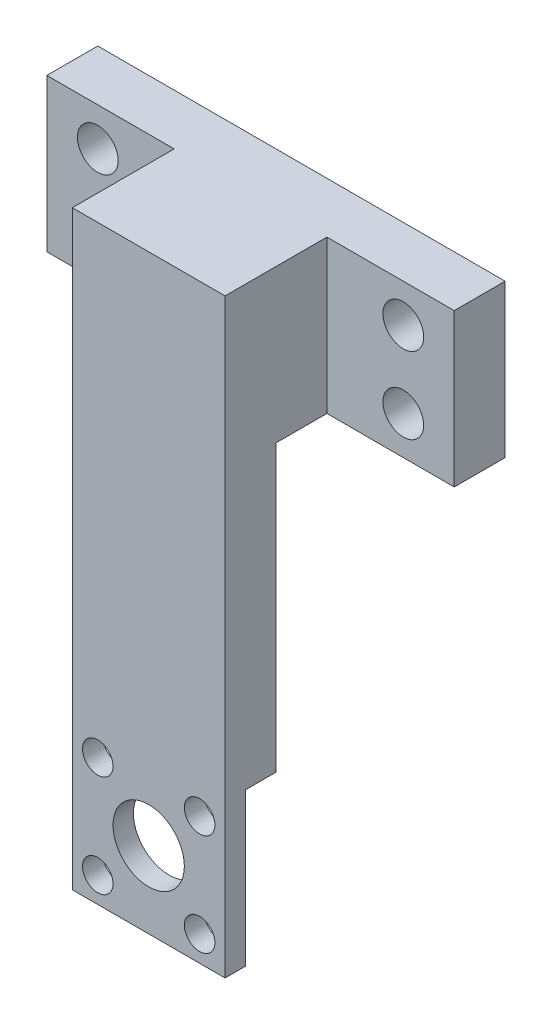
ISO-10303-21;
HEADER;
FILE_DESCRIPTION(('STEP AP214'),'2;1');
FILE_NAME('part.step','',(''),(''),'','','');
FILE_SCHEMA(('AUTOMOTIVE_DESIGN { 1 0 10303 214 1 1 1 1 }'));
ENDSEC;
DATA;
#1=APPLICATION_CONTEXT('core data for automotive mechanical design processes');
#2=APPLICATION_PROTOCOL_DEFINITION('international standard','automotive_design',2000,#1);
#3=PRODUCT_CONTEXT('',#1,'mechanical');
#4=PRODUCT('Part','Part','',(#3));
#5=PRODUCT_RELATED_PRODUCT_CATEGORY('part','',(#4));
#6=PRODUCT_DEFINITION_FORMATION('','',#4);
#7=PRODUCT_DEFINITION_CONTEXT('part definition',#1,'design');
#8=PRODUCT_DEFINITION('design','',#6,#7);
#9=PRODUCT_DEFINITION_SHAPE('','',#8);
#10=(LENGTH_UNIT() NAMED_UNIT(*) SI_UNIT(.MILLI.,.METRE.));
#11=(NAMED_UNIT(*) PLANE_ANGLE_UNIT() SI_UNIT($,.RADIAN.));
#12=(NAMED_UNIT(*) SI_UNIT($,.STERADIAN.) SOLID_ANGLE_UNIT());
#13=UNCERTAINTY_MEASURE_WITH_UNIT(LENGTH_MEASURE(1.E-05),#10,'distance_accuracy_value','');
#14=(GEOMETRIC_REPRESENTATION_CONTEXT(3) GLOBAL_UNCERTAINTY_ASSIGNED_CONTEXT((#13)) GLOBAL_UNIT_ASSIGNED_CONTEXT((#10,
#11,#12)) REPRESENTATION_CONTEXT('',''));
#15=CARTESIAN_POINT('',(0.,0.,0.));
#16=DIRECTION('',(0.,0.,1.));
#17=DIRECTION('',(1.,0.,0.));
#18=AXIS2_PLACEMENT_3D('',#15,#16,#17);
#19=CARTESIAN_POINT('',(0.,0.,5.));
#20=DIRECTION('',(0.,1.,0.));
#21=DIRECTION('',(0.,0.,1.));
#22=AXIS2_PLACEMENT_3D('',#19,#20,#21);
#23=PLANE('',#22);
#24=DIRECTION('',(1.,0.,0.));
#25=VECTOR('',#24,1.);
#26=CARTESIAN_POINT('',(12.5,0.,10.));
#27=LINE('',#26,#25);
#28=CARTESIAN_POINT('',(12.5,0.,10.));
#29=VERTEX_POINT('',#28);
#30=CARTESIAN_POINT('',(27.5,0.,10.));
#31=VERTEX_POINT('',#30);
#32=EDGE_CURVE('E62',#29,#31,#27,.T.);
#33=ORIENTED_EDGE('',*,*,#32,.F.);
#34=DIRECTION('',(0.,0.,-1.));
#35=VECTOR('',#34,1.);
#36=CARTESIAN_POINT('',(12.5,0.,15.));
#37=LINE('',#36,#35);
#38=CARTESIAN_POINT('',(12.5,0.,5.));
#39=VERTEX_POINT('',#38);
#40=EDGE_CURVE('E188',#29,#39,#37,.T.);
#41=ORIENTED_EDGE('',*,*,#40,.T.);
#42=DIRECTION('',(1.,0.,0.));
#43=VECTOR('',#42,1.);
#44=CARTESIAN_POINT('',(0.,0.,5.));
#45=LINE('',#44,#43);
#46=CARTESIAN_POINT('',(0.,0.,5.));
#47=VERTEX_POINT('',#46);
#48=EDGE_CURVE('E220',#47,#39,#45,.T.);
#49=ORIENTED_EDGE('',*,*,#48,.F.);
#50=DIRECTION('',(0.,0.,-1.));
#51=VECTOR('',#50,1.);
#52=CARTESIAN_POINT('',(0.,0.,5.));
#53=LINE('',#52,#51);
#54=CARTESIAN_POINT('',(0.,0.,0.));
#55=VERTEX_POINT('',#54);
#56=EDGE_CURVE('E11',#47,#55,#53,.T.);
#57=ORIENTED_EDGE('',*,*,#56,.T.);
#58=DIRECTION('',(1.,0.,0.));
#59=VECTOR('',#58,1.);
#60=CARTESIAN_POINT('',(0.,0.,0.));
#61=LINE('',#60,#59);
#62=CARTESIAN_POINT('',(40.,0.,0.));
#63=VERTEX_POINT('',#62);
#64=EDGE_CURVE('E231',#55,#63,#61,.T.);
#65=ORIENTED_EDGE('',*,*,#64,.T.);
#66=DIRECTION('',(0.,0.,-1.));
#67=VECTOR('',#66,1.);
#68=CARTESIAN_POINT('',(40.,0.,5.));
#69=LINE('',#68,#67);
#70=CARTESIAN_POINT('',(40.,0.,5.));
#71=VERTEX_POINT('',#70);
#72=EDGE_CURVE('E47',#71,#63,#69,.T.);
#73=ORIENTED_EDGE('',*,*,#72,.F.);
#74=CARTESIAN_POINT('',(27.5,0.,5.));
#75=VERTEX_POINT('',#74);
#76=EDGE_CURVE('E218',#75,#71,#45,.T.);
#77=ORIENTED_EDGE('',*,*,#76,.F.);
#78=DIRECTION('',(0.,0.,-1.));
#79=VECTOR('',#78,1.);
#80=CARTESIAN_POINT('',(27.5,0.,15.));
#81=LINE('',#80,#79);
#82=EDGE_CURVE('E186',#31,#75,#81,.T.);
#83=ORIENTED_EDGE('',*,*,#82,.F.);
#84=EDGE_LOOP('',(#33,#41,#49,#57,#65,#73,#77,#83));
#85=FACE_BOUND('',#84,.T.);
#86=ADVANCED_FACE('F39',(#85),#23,.F.);
#87=CARTESIAN_POINT('',(0.,0.,5.));
#88=DIRECTION('',(0.,0.,-1.));
#89=DIRECTION('',(-1.,0.,0.));
#90=AXIS2_PLACEMENT_3D('',#87,#88,#89);
#91=PLANE('',#90);
#92=CARTESIAN_POINT('',(5.,11.25,5.));
#93=DIRECTION('',(0.,0.,1.));
#94=DIRECTION('',(-1.,0.,0.));
#95=AXIS2_PLACEMENT_3D('',#92,#93,#94);
#96=CIRCLE('',#95,2.);
#97=CARTESIAN_POINT('',(3.,11.25,5.));
#98=VERTEX_POINT('',#97);
#99=EDGE_CURVE('E203',#98,#98,#96,.T.);
#100=ORIENTED_EDGE('',*,*,#99,.F.);
#101=EDGE_LOOP('',(#100));
#102=FACE_BOUND('',#101,.T.);
#103=CARTESIAN_POINT('',(5.,3.75,5.));
#104=DIRECTION('',(0.,0.,1.));
#105=DIRECTION('',(1.,0.,0.));
#106=AXIS2_PLACEMENT_3D('',#103,#104,#105);
#107=CIRCLE('',#106,2.);
#108=CARTESIAN_POINT('',(7.,3.75,5.));
#109=VERTEX_POINT('',#108);
#110=EDGE_CURVE('E209',#109,#109,#107,.T.);
#111=ORIENTED_EDGE('',*,*,#110,.F.);
#112=EDGE_LOOP('',(#111));
#113=FACE_BOUND('',#112,.T.);
#114=DIRECTION('',(0.,-1.,0.));
#115=VECTOR('',#114,1.);
#116=CARTESIAN_POINT('',(12.5,15.,5.));
#117=LINE('',#116,#115);
#118=CARTESIAN_POINT('',(12.5,15.,5.));
#119=VERTEX_POINT('',#118);
#120=EDGE_CURVE('E169',#119,#39,#117,.T.);
#121=ORIENTED_EDGE('',*,*,#120,.F.);
#122=DIRECTION('',(-1.,0.,0.));
#123=VECTOR('',#122,1.);
#124=CARTESIAN_POINT('',(0.,15.,5.));
#125=LINE('',#124,#123);
#126=CARTESIAN_POINT('',(0.,15.,5.));
#127=VERTEX_POINT('',#126);
#128=EDGE_CURVE('E225',#119,#127,#125,.T.);
#129=ORIENTED_EDGE('',*,*,#128,.T.);
#130=DIRECTION('',(0.,-1.,0.));
#131=VECTOR('',#130,1.);
#132=CARTESIAN_POINT('',(0.,0.,5.));
#133=LINE('',#132,#131);
#134=EDGE_CURVE('E215',#127,#47,#133,.T.);
#135=ORIENTED_EDGE('',*,*,#134,.T.);
#136=ORIENTED_EDGE('',*,*,#48,.T.);
#137=EDGE_LOOP('',(#121,#129,#135,#136));
#138=FACE_BOUND('',#137,.T.);
#139=ADVANCED_FACE('F262',(#102,#113,#138),#91,.F.);
#140=CARTESIAN_POINT('',(35.,11.25,5.));
#141=DIRECTION('',(0.,0.,1.));
#142=DIRECTION('',(1.,0.,0.));
#143=AXIS2_PLACEMENT_3D('',#140,#141,#142);
#144=CIRCLE('',#143,2.);
#145=CARTESIAN_POINT('',(37.,11.25,5.));
#146=VERTEX_POINT('',#145);
#147=EDGE_CURVE('E191',#146,#146,#144,.T.);
#148=ORIENTED_EDGE('',*,*,#147,.F.);
#149=EDGE_LOOP('',(#148));
#150=FACE_BOUND('',#149,.T.);
#151=CARTESIAN_POINT('',(35.,3.75,5.));
#152=DIRECTION('',(0.,0.,1.));
#153=DIRECTION('',(-1.,0.,0.));
#154=AXIS2_PLACEMENT_3D('',#151,#152,#153);
#155=CIRCLE('',#154,2.);
#156=CARTESIAN_POINT('',(33.,3.75,5.));
#157=VERTEX_POINT('',#156);
#158=EDGE_CURVE('E197',#157,#157,#155,.T.);
#159=ORIENTED_EDGE('',*,*,#158,.F.);
#160=EDGE_LOOP('',(#159));
#161=FACE_BOUND('',#160,.T.);
#162=DIRECTION('',(0.,1.,0.));
#163=VECTOR('',#162,1.);
#164=CARTESIAN_POINT('',(27.5,15.,5.));
#165=LINE('',#164,#163);
#166=CARTESIAN_POINT('',(27.5,15.,5.));
#167=VERTEX_POINT('',#166);
#168=EDGE_CURVE('E173',#75,#167,#165,.T.);
#169=ORIENTED_EDGE('',*,*,#168,.F.);
#170=ORIENTED_EDGE('',*,*,#76,.T.);
#171=DIRECTION('',(0.,1.,0.));
#172=VECTOR('',#171,1.);
#173=CARTESIAN_POINT('',(40.,0.,5.));
#174=LINE('',#173,#172);
#175=CARTESIAN_POINT('',(40.,15.,5.));
#176=VERTEX_POINT('',#175);
#177=EDGE_CURVE('E223',#71,#176,#174,.T.);
#178=ORIENTED_EDGE('',*,*,#177,.T.);
#179=EDGE_CURVE('E226',#176,#167,#125,.T.);
#180=ORIENTED_EDGE('',*,*,#179,.T.);
#181=EDGE_LOOP('',(#169,#170,#178,#180));
#182=FACE_BOUND('',#181,.T.);
#183=ADVANCED_FACE('F272',(#150,#161,#182),#91,.F.);
#184=CARTESIAN_POINT('',(0.,0.,0.));
#185=DIRECTION('',(0.,0.,-1.));
#186=DIRECTION('',(-1.,0.,0.));
#187=AXIS2_PLACEMENT_3D('',#184,#185,#186);
#188=PLANE('',#187);
#189=CARTESIAN_POINT('',(35.,3.75,0.));
#190=DIRECTION('',(0.,0.,1.));
#191=DIRECTION('',(-1.,0.,0.));
#192=AXIS2_PLACEMENT_3D('',#189,#190,#191);
#193=CIRCLE('',#192,2.);
#194=CARTESIAN_POINT('',(33.,3.75,0.));
#195=VERTEX_POINT('',#194);
#196=EDGE_CURVE('E194',#195,#195,#193,.T.);
#197=ORIENTED_EDGE('',*,*,#196,.T.);
#198=EDGE_LOOP('',(#197));
#199=FACE_BOUND('',#198,.T.);
#200=CARTESIAN_POINT('',(5.,3.75,0.));
#201=DIRECTION('',(0.,0.,1.));
#202=DIRECTION('',(1.,0.,0.));
#203=AXIS2_PLACEMENT_3D('',#200,#201,#202);
#204=CIRCLE('',#203,2.);
#205=CARTESIAN_POINT('',(7.,3.75,0.));
#206=VERTEX_POINT('',#205);
#207=EDGE_CURVE('E206',#206,#206,#204,.T.);
#208=ORIENTED_EDGE('',*,*,#207,.T.);
#209=EDGE_LOOP('',(#208));
#210=FACE_BOUND('',#209,.T.);
#211=DIRECTION('',(0.,-1.,0.));
#212=VECTOR('',#211,1.);
#213=CARTESIAN_POINT('',(0.,0.,0.));
#214=LINE('',#213,#212);
#215=CARTESIAN_POINT('',(0.,15.,0.));
#216=VERTEX_POINT('',#215);
#217=EDGE_CURVE('E212',#216,#55,#214,.T.);
#218=ORIENTED_EDGE('',*,*,#217,.F.);
#219=DIRECTION('',(-1.,0.,0.));
#220=VECTOR('',#219,1.);
#221=CARTESIAN_POINT('',(0.,15.,0.));
#222=LINE('',#221,#220);
#223=CARTESIAN_POINT('',(40.,15.,0.));
#224=VERTEX_POINT('',#223);
#225=EDGE_CURVE('E219',#224,#216,#222,.T.);
#226=ORIENTED_EDGE('',*,*,#225,.F.);
#227=DIRECTION('',(0.,1.,0.));
#228=VECTOR('',#227,1.);
#229=CARTESIAN_POINT('',(40.,0.,0.));
#230=LINE('',#229,#228);
#231=EDGE_CURVE('E233',#63,#224,#230,.T.);
#232=ORIENTED_EDGE('',*,*,#231,.F.);
#233=ORIENTED_EDGE('',*,*,#64,.F.);
#234=EDGE_LOOP('',(#218,#226,#232,#233));
#235=FACE_BOUND('',#234,.T.);
#236=CARTESIAN_POINT('',(5.,11.25,0.));
#237=DIRECTION('',(0.,0.,1.));
#238=DIRECTION('',(-1.,0.,0.));
#239=AXIS2_PLACEMENT_3D('',#236,#237,#238);
#240=CIRCLE('',#239,2.);
#241=CARTESIAN_POINT('',(3.,11.25,0.));
#242=VERTEX_POINT('',#241);
#243=EDGE_CURVE('E200',#242,#242,#240,.T.);
#244=ORIENTED_EDGE('',*,*,#243,.T.);
#245=EDGE_LOOP('',(#244));
#246=FACE_BOUND('',#245,.T.);
#247=CARTESIAN_POINT('',(35.,11.25,0.));
#248=DIRECTION('',(0.,0.,1.));
#249=DIRECTION('',(1.,0.,0.));
#250=AXIS2_PLACEMENT_3D('',#247,#248,#249);
#251=CIRCLE('',#250,2.);
#252=CARTESIAN_POINT('',(37.,11.25,0.));
#253=VERTEX_POINT('',#252);
#254=EDGE_CURVE('E190',#253,#253,#251,.T.);
#255=ORIENTED_EDGE('',*,*,#254,.T.);
#256=EDGE_LOOP('',(#255));
#257=FACE_BOUND('',#256,.T.);
#258=ADVANCED_FACE('F251',(#199,#210,#235,#246,#257),#188,.T.);
#259=CARTESIAN_POINT('',(0.,0.,5.));
#260=DIRECTION('',(1.,0.,0.));
#261=DIRECTION('',(0.,0.,-1.));
#262=AXIS2_PLACEMENT_3D('',#259,#260,#261);
#263=PLANE('',#262);
#264=ORIENTED_EDGE('',*,*,#217,.T.);
#265=ORIENTED_EDGE('',*,*,#56,.F.);
#266=ORIENTED_EDGE('',*,*,#134,.F.);
#267=DIRECTION('',(0.,0.,-1.));
#268=VECTOR('',#267,1.);
#269=CARTESIAN_POINT('',(0.,15.,5.));
#270=LINE('',#269,#268);
#271=EDGE_CURVE('E228',#127,#216,#270,.T.);
#272=ORIENTED_EDGE('',*,*,#271,.T.);
#273=EDGE_LOOP('',(#264,#265,#266,#272));
#274=FACE_BOUND('',#273,.T.);
#275=ADVANCED_FACE('F41',(#274),#263,.F.);
#276=CARTESIAN_POINT('',(40.,0.,5.));
#277=DIRECTION('',(-1.,0.,0.));
#278=DIRECTION('',(0.,0.,1.));
#279=AXIS2_PLACEMENT_3D('',#276,#277,#278);
#280=PLANE('',#279);
#281=ORIENTED_EDGE('',*,*,#231,.T.);
#282=DIRECTION('',(0.,0.,-1.));
#283=VECTOR('',#282,1.);
#284=CARTESIAN_POINT('',(40.,15.,5.));
#285=LINE('',#284,#283);
#286=EDGE_CURVE('E238',#176,#224,#285,.T.);
#287=ORIENTED_EDGE('',*,*,#286,.F.);
#288=ORIENTED_EDGE('',*,*,#177,.F.);
#289=ORIENTED_EDGE('',*,*,#72,.T.);
#290=EDGE_LOOP('',(#281,#287,#288,#289));
#291=FACE_BOUND('',#290,.T.);
#292=ADVANCED_FACE('F245',(#291),#280,.F.);
#293=CARTESIAN_POINT('',(0.,15.,5.));
#294=DIRECTION('',(0.,-1.,0.));
#295=DIRECTION('',(0.,0.,-1.));
#296=AXIS2_PLACEMENT_3D('',#293,#294,#295);
#297=PLANE('',#296);
#298=ORIENTED_EDGE('',*,*,#225,.T.);
#299=ORIENTED_EDGE('',*,*,#271,.F.);
#300=ORIENTED_EDGE('',*,*,#128,.F.);
#301=DIRECTION('',(0.,0.,-1.));
#302=VECTOR('',#301,1.);
#303=CARTESIAN_POINT('',(12.5,15.,15.));
#304=LINE('',#303,#302);
#305=CARTESIAN_POINT('',(12.5,15.,15.));
#306=VERTEX_POINT('',#305);
#307=EDGE_CURVE('E177',#306,#119,#304,.T.);
#308=ORIENTED_EDGE('',*,*,#307,.F.);
#309=DIRECTION('',(-1.,0.,0.));
#310=VECTOR('',#309,1.);
#311=CARTESIAN_POINT('',(12.5,15.,15.));
#312=LINE('',#311,#310);
#313=CARTESIAN_POINT('',(27.5,15.,15.));
#314=VERTEX_POINT('',#313);
#315=EDGE_CURVE('E175',#314,#306,#312,.T.);
#316=ORIENTED_EDGE('',*,*,#315,.F.);
#317=DIRECTION('',(0.,0.,-1.));
#318=VECTOR('',#317,1.);
#319=CARTESIAN_POINT('',(27.5,15.,15.));
#320=LINE('',#319,#318);
#321=EDGE_CURVE('E183',#314,#167,#320,.T.);
#322=ORIENTED_EDGE('',*,*,#321,.T.);
#323=ORIENTED_EDGE('',*,*,#179,.F.);
#324=ORIENTED_EDGE('',*,*,#286,.T.);
#325=EDGE_LOOP('',(#298,#299,#300,#308,#316,#322,#323,#324));
#326=FACE_BOUND('',#325,.T.);
#327=ADVANCED_FACE('F255',(#326),#297,.F.);
#328=CARTESIAN_POINT('',(5.,3.75,5.));
#329=DIRECTION('',(0.,0.,-1.));
#330=DIRECTION('',(-1.,0.,0.));
#331=AXIS2_PLACEMENT_3D('',#328,#329,#330);
#332=CYLINDRICAL_SURFACE('',#331,2.);
#333=ORIENTED_EDGE('',*,*,#110,.T.);
#334=EDGE_LOOP('',(#333));
#335=FACE_BOUND('',#334,.T.);
#336=ORIENTED_EDGE('',*,*,#207,.F.);
#337=EDGE_LOOP('',(#336));
#338=FACE_BOUND('',#337,.T.);
#339=ADVANCED_FACE('F348',(#335,#338),#332,.F.);
#340=CARTESIAN_POINT('',(5.,11.25,5.));
#341=DIRECTION('',(0.,0.,-1.));
#342=DIRECTION('',(-1.,0.,0.));
#343=AXIS2_PLACEMENT_3D('',#340,#341,#342);
#344=CYLINDRICAL_SURFACE('',#343,2.);
#345=ORIENTED_EDGE('',*,*,#99,.T.);
#346=EDGE_LOOP('',(#345));
#347=FACE_BOUND('',#346,.T.);
#348=ORIENTED_EDGE('',*,*,#243,.F.);
#349=EDGE_LOOP('',(#348));
#350=FACE_BOUND('',#349,.T.);
#351=ADVANCED_FACE('F354',(#347,#350),#344,.F.);
#352=CARTESIAN_POINT('',(35.,3.75,5.));
#353=DIRECTION('',(0.,0.,-1.));
#354=DIRECTION('',(-1.,0.,0.));
#355=AXIS2_PLACEMENT_3D('',#352,#353,#354);
#356=CYLINDRICAL_SURFACE('',#355,2.);
#357=ORIENTED_EDGE('',*,*,#158,.T.);
#358=EDGE_LOOP('',(#357));
#359=FACE_BOUND('',#358,.T.);
#360=ORIENTED_EDGE('',*,*,#196,.F.);
#361=EDGE_LOOP('',(#360));
#362=FACE_BOUND('',#361,.T.);
#363=ADVANCED_FACE('F358',(#359,#362),#356,.F.);
#364=CARTESIAN_POINT('',(35.,11.25,5.));
#365=DIRECTION('',(0.,0.,-1.));
#366=DIRECTION('',(-1.,0.,0.));
#367=AXIS2_PLACEMENT_3D('',#364,#365,#366);
#368=CYLINDRICAL_SURFACE('',#367,2.);
#369=ORIENTED_EDGE('',*,*,#147,.T.);
#370=EDGE_LOOP('',(#369));
#371=FACE_BOUND('',#370,.T.);
#372=ORIENTED_EDGE('',*,*,#254,.F.);
#373=EDGE_LOOP('',(#372));
#374=FACE_BOUND('',#373,.T.);
#375=ADVANCED_FACE('F362',(#371,#374),#368,.F.);
#376=CARTESIAN_POINT('',(12.5,15.,15.));
#377=DIRECTION('',(1.,0.,0.));
#378=DIRECTION('',(0.,1.,0.));
#379=AXIS2_PLACEMENT_3D('',#376,#377,#378);
#380=PLANE('',#379);
#381=ORIENTED_EDGE('',*,*,#120,.T.);
#382=ORIENTED_EDGE('',*,*,#40,.F.);
#383=DIRECTION('',(0.,1.,0.));
#384=VECTOR('',#383,1.);
#385=CARTESIAN_POINT('',(12.5,-28.,10.));
#386=LINE('',#385,#384);
#387=CARTESIAN_POINT('',(12.5,-28.,10.));
#388=VERTEX_POINT('',#387);
#389=EDGE_CURVE('E166',#388,#29,#386,.T.);
#390=ORIENTED_EDGE('',*,*,#389,.F.);
#391=DIRECTION('',(0.,0.,-1.));
#392=VECTOR('',#391,1.);
#393=CARTESIAN_POINT('',(12.5,-28.,15.));
#394=LINE('',#393,#392);
#395=CARTESIAN_POINT('',(12.5,-28.,13.));
#396=VERTEX_POINT('',#395);
#397=EDGE_CURVE('E152',#396,#388,#394,.T.);
#398=ORIENTED_EDGE('',*,*,#397,.F.);
#399=DIRECTION('',(0.,1.,0.));
#400=VECTOR('',#399,1.);
#401=CARTESIAN_POINT('',(12.5,-43.,13.));
#402=LINE('',#401,#400);
#403=CARTESIAN_POINT('',(12.5,-43.,13.));
#404=VERTEX_POINT('',#403);
#405=EDGE_CURVE('E132',#404,#396,#402,.T.);
#406=ORIENTED_EDGE('',*,*,#405,.F.);
#407=DIRECTION('',(0.,0.,-1.));
#408=VECTOR('',#407,1.);
#409=CARTESIAN_POINT('',(12.5,-43.,15.));
#410=LINE('',#409,#408);
#411=CARTESIAN_POINT('',(12.5,-43.,15.));
#412=VERTEX_POINT('',#411);
#413=EDGE_CURVE('E139',#412,#404,#410,.T.);
#414=ORIENTED_EDGE('',*,*,#413,.F.);
#415=DIRECTION('',(0.,-1.,0.));
#416=VECTOR('',#415,1.);
#417=CARTESIAN_POINT('',(12.5,15.,15.));
#418=LINE('',#417,#416);
#419=EDGE_CURVE('E170',#306,#412,#418,.T.);
#420=ORIENTED_EDGE('',*,*,#419,.F.);
#421=ORIENTED_EDGE('',*,*,#307,.T.);
#422=EDGE_LOOP('',(#381,#382,#390,#398,#406,#414,#420,#421));
#423=FACE_BOUND('',#422,.T.);
#424=ADVANCED_FACE('F150',(#423),#380,.F.);
#425=CARTESIAN_POINT('',(27.5,15.,15.));
#426=DIRECTION('',(-1.,0.,0.));
#427=DIRECTION('',(0.,0.,1.));
#428=AXIS2_PLACEMENT_3D('',#425,#426,#427);
#429=PLANE('',#428);
#430=ORIENTED_EDGE('',*,*,#168,.T.);
#431=ORIENTED_EDGE('',*,*,#321,.F.);
#432=DIRECTION('',(0.,1.,0.));
#433=VECTOR('',#432,1.);
#434=CARTESIAN_POINT('',(27.5,15.,15.));
#435=LINE('',#434,#433);
#436=CARTESIAN_POINT('',(27.5,-43.,15.));
#437=VERTEX_POINT('',#436);
#438=EDGE_CURVE('E172',#437,#314,#435,.T.);
#439=ORIENTED_EDGE('',*,*,#438,.F.);
#440=DIRECTION('',(0.,0.,1.));
#441=VECTOR('',#440,1.);
#442=CARTESIAN_POINT('',(27.5,-43.,15.));
#443=LINE('',#442,#441);
#444=CARTESIAN_POINT('',(27.5,-43.,13.));
#445=VERTEX_POINT('',#444);
#446=EDGE_CURVE('E138',#445,#437,#443,.T.);
#447=ORIENTED_EDGE('',*,*,#446,.F.);
#448=DIRECTION('',(0.,1.,0.));
#449=VECTOR('',#448,1.);
#450=CARTESIAN_POINT('',(27.5,-43.,13.));
#451=LINE('',#450,#449);
#452=CARTESIAN_POINT('',(27.5,-28.,13.));
#453=VERTEX_POINT('',#452);
#454=EDGE_CURVE('E134',#445,#453,#451,.T.);
#455=ORIENTED_EDGE('',*,*,#454,.T.);
#456=DIRECTION('',(0.,0.,1.));
#457=VECTOR('',#456,1.);
#458=CARTESIAN_POINT('',(27.5,-28.,15.));
#459=LINE('',#458,#457);
#460=CARTESIAN_POINT('',(27.5,-28.,10.));
#461=VERTEX_POINT('',#460);
#462=EDGE_CURVE('E161',#461,#453,#459,.T.);
#463=ORIENTED_EDGE('',*,*,#462,.F.);
#464=DIRECTION('',(0.,1.,0.));
#465=VECTOR('',#464,1.);
#466=CARTESIAN_POINT('',(27.5,-28.,10.));
#467=LINE('',#466,#465);
#468=EDGE_CURVE('E162',#461,#31,#467,.T.);
#469=ORIENTED_EDGE('',*,*,#468,.T.);
#470=ORIENTED_EDGE('',*,*,#82,.T.);
#471=EDGE_LOOP('',(#430,#431,#439,#447,#455,#463,#469,#470));
#472=FACE_BOUND('',#471,.T.);
#473=ADVANCED_FACE('F269',(#472),#429,.F.);
#474=CARTESIAN_POINT('',(0.,0.,15.));
#475=DIRECTION('',(0.,0.,1.));
#476=DIRECTION('',(1.,0.,0.));
#477=AXIS2_PLACEMENT_3D('',#474,#475,#476);
#478=PLANE('',#477);
#479=CARTESIAN_POINT('',(20.,-35.5,15.));
#480=DIRECTION('',(0.,0.,1.));
#481=DIRECTION('',(1.,0.,0.));
#482=AXIS2_PLACEMENT_3D('',#479,#480,#481);
#483=CIRCLE('',#482,3.5);
#484=CARTESIAN_POINT('',(23.5,-35.5,15.));
#485=VERTEX_POINT('',#484);
#486=EDGE_CURVE('E279',#485,#485,#483,.T.);
#487=ORIENTED_EDGE('',*,*,#486,.F.);
#488=EDGE_LOOP('',(#487));
#489=FACE_BOUND('',#488,.T.);
#490=CARTESIAN_POINT('',(25.,-30.5,15.));
#491=DIRECTION('',(0.,0.,1.));
#492=DIRECTION('',(1.,0.,0.));
#493=AXIS2_PLACEMENT_3D('',#490,#491,#492);
#494=CIRCLE('',#493,1.5);
#495=CARTESIAN_POINT('',(26.5,-30.5,15.));
#496=VERTEX_POINT('',#495);
#497=EDGE_CURVE('E281',#496,#496,#494,.T.);
#498=ORIENTED_EDGE('',*,*,#497,.F.);
#499=EDGE_LOOP('',(#498));
#500=FACE_BOUND('',#499,.T.);
#501=CARTESIAN_POINT('',(15.,-40.5,15.));
#502=DIRECTION('',(0.,0.,1.));
#503=DIRECTION('',(1.,0.,0.));
#504=AXIS2_PLACEMENT_3D('',#501,#502,#503);
#505=CIRCLE('',#504,1.5);
#506=CARTESIAN_POINT('',(16.5,-40.5,15.));
#507=VERTEX_POINT('',#506);
#508=EDGE_CURVE('E288',#507,#507,#505,.T.);
#509=ORIENTED_EDGE('',*,*,#508,.F.);
#510=EDGE_LOOP('',(#509));
#511=FACE_BOUND('',#510,.T.);
#512=CARTESIAN_POINT('',(25.,-40.5,15.));
#513=DIRECTION('',(0.,0.,1.));
#514=DIRECTION('',(1.,0.,0.));
#515=AXIS2_PLACEMENT_3D('',#512,#513,#514);
#516=CIRCLE('',#515,1.5);
#517=CARTESIAN_POINT('',(26.5,-40.5,15.));
#518=VERTEX_POINT('',#517);
#519=EDGE_CURVE('E291',#518,#518,#516,.T.);
#520=ORIENTED_EDGE('',*,*,#519,.F.);
#521=EDGE_LOOP('',(#520));
#522=FACE_BOUND('',#521,.T.);
#523=CARTESIAN_POINT('',(15.,-30.5,15.));
#524=DIRECTION('',(0.,0.,1.));
#525=DIRECTION('',(1.,0.,0.));
#526=AXIS2_PLACEMENT_3D('',#523,#524,#525);
#527=CIRCLE('',#526,1.5);
#528=CARTESIAN_POINT('',(16.5,-30.5,15.));
#529=VERTEX_POINT('',#528);
#530=EDGE_CURVE('E294',#529,#529,#527,.T.);
#531=ORIENTED_EDGE('',*,*,#530,.F.);
#532=EDGE_LOOP('',(#531));
#533=FACE_BOUND('',#532,.T.);
#534=ORIENTED_EDGE('',*,*,#419,.T.);
#535=DIRECTION('',(-1.,0.,0.));
#536=VECTOR('',#535,1.);
#537=CARTESIAN_POINT('',(12.5,-43.,15.));
#538=LINE('',#537,#536);
#539=EDGE_CURVE('E145',#437,#412,#538,.T.);
#540=ORIENTED_EDGE('',*,*,#539,.F.);
#541=ORIENTED_EDGE('',*,*,#438,.T.);
#542=ORIENTED_EDGE('',*,*,#315,.T.);
#543=EDGE_LOOP('',(#534,#540,#541,#542));
#544=FACE_BOUND('',#543,.T.);
#545=ADVANCED_FACE('F266',(#489,#500,#511,#522,#533,#544),#478,.T.);
#546=CARTESIAN_POINT('',(12.5,-28.,10.));
#547=DIRECTION('',(0.,0.,1.));
#548=DIRECTION('',(1.,0.,0.));
#549=AXIS2_PLACEMENT_3D('',#546,#547,#548);
#550=PLANE('',#549);
#551=ORIENTED_EDGE('',*,*,#32,.T.);
#552=ORIENTED_EDGE('',*,*,#468,.F.);
#553=DIRECTION('',(1.,0.,0.));
#554=VECTOR('',#553,1.);
#555=CARTESIAN_POINT('',(12.5,-28.,10.));
#556=LINE('',#555,#554);
#557=EDGE_CURVE('E159',#388,#461,#556,.T.);
#558=ORIENTED_EDGE('',*,*,#557,.F.);
#559=ORIENTED_EDGE('',*,*,#389,.T.);
#560=EDGE_LOOP('',(#551,#552,#558,#559));
#561=FACE_BOUND('',#560,.T.);
#562=ADVANCED_FACE('F275',(#561),#550,.F.);
#563=CARTESIAN_POINT('',(0.,-28.,0.));
#564=DIRECTION('',(0.,-1.,0.));
#565=DIRECTION('',(0.,0.,-1.));
#566=AXIS2_PLACEMENT_3D('',#563,#564,#565);
#567=PLANE('',#566);
#568=DIRECTION('',(1.,0.,0.));
#569=VECTOR('',#568,1.);
#570=CARTESIAN_POINT('',(12.5,-28.,13.));
#571=LINE('',#570,#569);
#572=EDGE_CURVE('E54',#396,#453,#571,.T.);
#573=ORIENTED_EDGE('',*,*,#572,.F.);
#574=ORIENTED_EDGE('',*,*,#397,.T.);
#575=ORIENTED_EDGE('',*,*,#557,.T.);
#576=ORIENTED_EDGE('',*,*,#462,.T.);
#577=EDGE_LOOP('',(#573,#574,#575,#576));
#578=FACE_BOUND('',#577,.T.);
#579=ADVANCED_FACE('F278',(#578),#567,.T.);
#580=CARTESIAN_POINT('',(12.5,-43.,13.));
#581=DIRECTION('',(0.,0.,1.));
#582=DIRECTION('',(1.,0.,0.));
#583=AXIS2_PLACEMENT_3D('',#580,#581,#582);
#584=PLANE('',#583);
#585=CARTESIAN_POINT('',(20.,-35.5,13.));
#586=DIRECTION('',(0.,0.,-1.));
#587=DIRECTION('',(-1.,0.,0.));
#588=AXIS2_PLACEMENT_3D('',#585,#586,#587);
#589=CIRCLE('',#588,3.5);
#590=CARTESIAN_POINT('',(16.5,-35.5,13.));
#591=VERTEX_POINT('',#590);
#592=EDGE_CURVE('E303',#591,#591,#589,.T.);
#593=ORIENTED_EDGE('',*,*,#592,.F.);
#594=EDGE_LOOP('',(#593));
#595=FACE_BOUND('',#594,.T.);
#596=CARTESIAN_POINT('',(25.,-30.5,13.));
#597=DIRECTION('',(0.,0.,-1.));
#598=DIRECTION('',(-1.,0.,0.));
#599=AXIS2_PLACEMENT_3D('',#596,#597,#598);
#600=CIRCLE('',#599,1.5);
#601=CARTESIAN_POINT('',(23.5,-30.5,13.));
#602=VERTEX_POINT('',#601);
#603=EDGE_CURVE('E300',#602,#602,#600,.T.);
#604=ORIENTED_EDGE('',*,*,#603,.F.);
#605=EDGE_LOOP('',(#604));
#606=FACE_BOUND('',#605,.T.);
#607=CARTESIAN_POINT('',(15.,-40.5,13.));
#608=DIRECTION('',(0.,0.,-1.));
#609=DIRECTION('',(-1.,0.,0.));
#610=AXIS2_PLACEMENT_3D('',#607,#608,#609);
#611=CIRCLE('',#610,1.5);
#612=CARTESIAN_POINT('',(13.5,-40.5,13.));
#613=VERTEX_POINT('',#612);
#614=EDGE_CURVE('E306',#613,#613,#611,.T.);
#615=ORIENTED_EDGE('',*,*,#614,.F.);
#616=EDGE_LOOP('',(#615));
#617=FACE_BOUND('',#616,.T.);
#618=CARTESIAN_POINT('',(25.,-40.5,13.));
#619=DIRECTION('',(0.,0.,-1.));
#620=DIRECTION('',(-1.,0.,0.));
#621=AXIS2_PLACEMENT_3D('',#618,#619,#620);
#622=CIRCLE('',#621,1.5);
#623=CARTESIAN_POINT('',(23.5,-40.5,13.));
#624=VERTEX_POINT('',#623);
#625=EDGE_CURVE('E307',#624,#624,#622,.T.);
#626=ORIENTED_EDGE('',*,*,#625,.F.);
#627=EDGE_LOOP('',(#626));
#628=FACE_BOUND('',#627,.T.);
#629=CARTESIAN_POINT('',(15.,-30.5,13.));
#630=DIRECTION('',(0.,0.,-1.));
#631=DIRECTION('',(-1.,0.,0.));
#632=AXIS2_PLACEMENT_3D('',#629,#630,#631);
#633=CIRCLE('',#632,1.5);
#634=CARTESIAN_POINT('',(13.5,-30.5,13.));
#635=VERTEX_POINT('',#634);
#636=EDGE_CURVE('E297',#635,#635,#633,.T.);
#637=ORIENTED_EDGE('',*,*,#636,.F.);
#638=EDGE_LOOP('',(#637));
#639=FACE_BOUND('',#638,.T.);
#640=ORIENTED_EDGE('',*,*,#572,.T.);
#641=ORIENTED_EDGE('',*,*,#454,.F.);
#642=DIRECTION('',(1.,0.,0.));
#643=VECTOR('',#642,1.);
#644=CARTESIAN_POINT('',(12.5,-43.,13.));
#645=LINE('',#644,#643);
#646=EDGE_CURVE('E128',#404,#445,#645,.T.);
#647=ORIENTED_EDGE('',*,*,#646,.F.);
#648=ORIENTED_EDGE('',*,*,#405,.T.);
#649=EDGE_LOOP('',(#640,#641,#647,#648));
#650=FACE_BOUND('',#649,.T.);
#651=ADVANCED_FACE('F130',(#595,#606,#617,#628,#639,#650),#584,.F.);
#652=CARTESIAN_POINT('',(0.,-43.,0.));
#653=DIRECTION('',(0.,-1.,0.));
#654=DIRECTION('',(0.,0.,-1.));
#655=AXIS2_PLACEMENT_3D('',#652,#653,#654);
#656=PLANE('',#655);
#657=ORIENTED_EDGE('',*,*,#413,.T.);
#658=ORIENTED_EDGE('',*,*,#646,.T.);
#659=ORIENTED_EDGE('',*,*,#446,.T.);
#660=ORIENTED_EDGE('',*,*,#539,.T.);
#661=EDGE_LOOP('',(#657,#658,#659,#660));
#662=FACE_BOUND('',#661,.T.);
#663=ADVANCED_FACE('F143',(#662),#656,.T.);
#664=CARTESIAN_POINT('',(15.,-30.5,28.));
#665=DIRECTION('',(0.,0.,-1.));
#666=DIRECTION('',(-1.,0.,0.));
#667=AXIS2_PLACEMENT_3D('',#664,#665,#666);
#668=CYLINDRICAL_SURFACE('',#667,1.5);
#669=ORIENTED_EDGE('',*,*,#530,.T.);
#670=EDGE_LOOP('',(#669));
#671=FACE_BOUND('',#670,.T.);
#672=ORIENTED_EDGE('',*,*,#636,.T.);
#673=EDGE_LOOP('',(#672));
#674=FACE_BOUND('',#673,.T.);
#675=ADVANCED_FACE('F323',(#671,#674),#668,.F.);
#676=CARTESIAN_POINT('',(25.,-40.5,28.));
#677=DIRECTION('',(0.,0.,-1.));
#678=DIRECTION('',(-1.,0.,0.));
#679=AXIS2_PLACEMENT_3D('',#676,#677,#678);
#680=CYLINDRICAL_SURFACE('',#679,1.5);
#681=ORIENTED_EDGE('',*,*,#519,.T.);
#682=EDGE_LOOP('',(#681));
#683=FACE_BOUND('',#682,.T.);
#684=ORIENTED_EDGE('',*,*,#625,.T.);
#685=EDGE_LOOP('',(#684));
#686=FACE_BOUND('',#685,.T.);
#687=ADVANCED_FACE('F325',(#683,#686),#680,.F.);
#688=CARTESIAN_POINT('',(15.,-40.5,28.));
#689=DIRECTION('',(0.,0.,-1.));
#690=DIRECTION('',(-1.,0.,0.));
#691=AXIS2_PLACEMENT_3D('',#688,#689,#690);
#692=CYLINDRICAL_SURFACE('',#691,1.5);
#693=ORIENTED_EDGE('',*,*,#508,.T.);
#694=EDGE_LOOP('',(#693));
#695=FACE_BOUND('',#694,.T.);
#696=ORIENTED_EDGE('',*,*,#614,.T.);
#697=EDGE_LOOP('',(#696));
#698=FACE_BOUND('',#697,.T.);
#699=ADVANCED_FACE('F313',(#695,#698),#692,.F.);
#700=CARTESIAN_POINT('',(25.,-30.5,28.));
#701=DIRECTION('',(0.,0.,-1.));
#702=DIRECTION('',(-1.,0.,0.));
#703=AXIS2_PLACEMENT_3D('',#700,#701,#702);
#704=CYLINDRICAL_SURFACE('',#703,1.5);
#705=ORIENTED_EDGE('',*,*,#497,.T.);
#706=EDGE_LOOP('',(#705));
#707=FACE_BOUND('',#706,.T.);
#708=ORIENTED_EDGE('',*,*,#603,.T.);
#709=EDGE_LOOP('',(#708));
#710=FACE_BOUND('',#709,.T.);
#711=ADVANCED_FACE('F418',(#707,#710),#704,.F.);
#712=CARTESIAN_POINT('',(20.,-35.5,28.));
#713=DIRECTION('',(0.,0.,-1.));
#714=DIRECTION('',(-1.,0.,0.));
#715=AXIS2_PLACEMENT_3D('',#712,#713,#714);
#716=CYLINDRICAL_SURFACE('',#715,3.5);
#717=ORIENTED_EDGE('',*,*,#486,.T.);
#718=EDGE_LOOP('',(#717));
#719=FACE_BOUND('',#718,.T.);
#720=ORIENTED_EDGE('',*,*,#592,.T.);
#721=EDGE_LOOP('',(#720));
#722=FACE_BOUND('',#721,.T.);
#723=ADVANCED_FACE('F427',(#719,#722),#716,.F.);
#724=CLOSED_SHELL('',(#86,#139,#183,#258,#275,#292,#327,#339,#351,#363,#375,#424,#473,#545,#562,
#579,#651,#663,#675,#687,#699,#711,#723));
#725=MANIFOLD_SOLID_BREP('B2',#724);
#726=ADVANCED_BREP_SHAPE_REPRESENTATION('',(#18,#725),#14);
#727=SHAPE_DEFINITION_REPRESENTATION(#9,#726);
ENDSEC;
END-ISO-10303-21;
